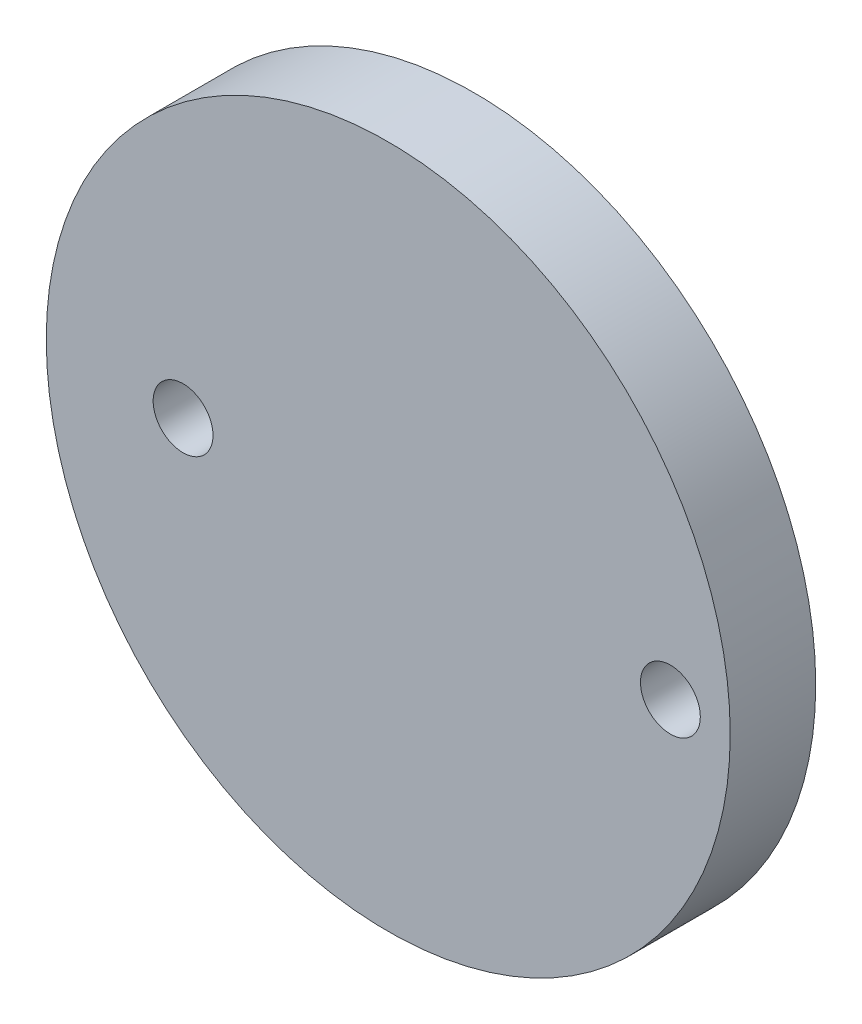
ISO-10303-21;
HEADER;
FILE_DESCRIPTION(('STEP AP214'),'2;1');
FILE_NAME('part.step','',(''),(''),'','','');
FILE_SCHEMA(('AUTOMOTIVE_DESIGN { 1 0 10303 214 1 1 1 1 }'));
ENDSEC;
DATA;
#1=APPLICATION_CONTEXT('core data for automotive mechanical design processes');
#2=APPLICATION_PROTOCOL_DEFINITION('international standard','automotive_design',2000,#1);
#3=PRODUCT_CONTEXT('',#1,'mechanical');
#4=PRODUCT('Part','Part','',(#3));
#5=PRODUCT_RELATED_PRODUCT_CATEGORY('part','',(#4));
#6=PRODUCT_DEFINITION_FORMATION('','',#4);
#7=PRODUCT_DEFINITION_CONTEXT('part definition',#1,'design');
#8=PRODUCT_DEFINITION('design','',#6,#7);
#9=PRODUCT_DEFINITION_SHAPE('','',#8);
#10=(LENGTH_UNIT() NAMED_UNIT(*) SI_UNIT(.MILLI.,.METRE.));
#11=(NAMED_UNIT(*) PLANE_ANGLE_UNIT() SI_UNIT($,.RADIAN.));
#12=(NAMED_UNIT(*) SI_UNIT($,.STERADIAN.) SOLID_ANGLE_UNIT());
#13=UNCERTAINTY_MEASURE_WITH_UNIT(LENGTH_MEASURE(1.E-05),#10,'distance_accuracy_value','');
#14=(GEOMETRIC_REPRESENTATION_CONTEXT(3) GLOBAL_UNCERTAINTY_ASSIGNED_CONTEXT((#13)) GLOBAL_UNIT_ASSIGNED_CONTEXT((#10,
#11,#12)) REPRESENTATION_CONTEXT('',''));
#15=CARTESIAN_POINT('',(0.,0.,0.));
#16=DIRECTION('',(0.,0.,1.));
#17=DIRECTION('',(1.,0.,0.));
#18=AXIS2_PLACEMENT_3D('',#15,#16,#17);
#19=CARTESIAN_POINT('',(0.,0.,5.));
#20=DIRECTION('',(0.,0.,-1.));
#21=DIRECTION('',(-1.,0.,0.));
#22=AXIS2_PLACEMENT_3D('',#19,#20,#21);
#23=CYLINDRICAL_SURFACE('',#22,20.);
#24=CARTESIAN_POINT('',(0.,0.,5.));
#25=DIRECTION('',(0.,0.,1.));
#26=DIRECTION('',(1.,0.,0.));
#27=AXIS2_PLACEMENT_3D('',#24,#25,#26);
#28=CIRCLE('',#27,20.);
#29=CARTESIAN_POINT('',(20.,0.,5.));
#30=VERTEX_POINT('',#29);
#31=EDGE_CURVE('E10',#30,#30,#28,.T.);
#32=ORIENTED_EDGE('',*,*,#31,.F.);
#33=EDGE_LOOP('',(#32));
#34=FACE_BOUND('',#33,.T.);
#35=CARTESIAN_POINT('',(0.,0.,0.));
#36=DIRECTION('',(0.,0.,1.));
#37=DIRECTION('',(1.,0.,0.));
#38=AXIS2_PLACEMENT_3D('',#35,#36,#37);
#39=CIRCLE('',#38,20.);
#40=CARTESIAN_POINT('',(20.,0.,0.));
#41=VERTEX_POINT('',#40);
#42=EDGE_CURVE('E34',#41,#41,#39,.T.);
#43=ORIENTED_EDGE('',*,*,#42,.T.);
#44=EDGE_LOOP('',(#43));
#45=FACE_BOUND('',#44,.T.);
#46=ADVANCED_FACE('F31',(#34,#45),#23,.T.);
#47=CARTESIAN_POINT('',(0.,0.,5.));
#48=DIRECTION('',(0.,0.,1.));
#49=DIRECTION('',(1.,0.,0.));
#50=AXIS2_PLACEMENT_3D('',#47,#48,#49);
#51=PLANE('',#50);
#52=CARTESIAN_POINT('',(-12.,0.,5.));
#53=DIRECTION('',(0.,0.,1.));
#54=DIRECTION('',(1.,0.,0.));
#55=AXIS2_PLACEMENT_3D('',#52,#53,#54);
#56=CIRCLE('',#55,1.75);
#57=CARTESIAN_POINT('',(-10.25,0.,5.));
#58=VERTEX_POINT('',#57);
#59=EDGE_CURVE('E49',#58,#58,#56,.T.);
#60=ORIENTED_EDGE('',*,*,#59,.F.);
#61=EDGE_LOOP('',(#60));
#62=FACE_BOUND('',#61,.T.);
#63=CARTESIAN_POINT('',(16.5,0.,5.));
#64=DIRECTION('',(0.,0.,1.));
#65=DIRECTION('',(1.,0.,0.));
#66=AXIS2_PLACEMENT_3D('',#63,#64,#65);
#67=CIRCLE('',#66,1.75);
#68=CARTESIAN_POINT('',(18.25,0.,5.));
#69=VERTEX_POINT('',#68);
#70=EDGE_CURVE('E43',#69,#69,#67,.T.);
#71=ORIENTED_EDGE('',*,*,#70,.F.);
#72=EDGE_LOOP('',(#71));
#73=FACE_BOUND('',#72,.T.);
#74=ORIENTED_EDGE('',*,*,#31,.T.);
#75=EDGE_LOOP('',(#74));
#76=FACE_BOUND('',#75,.T.);
#77=ADVANCED_FACE('F65',(#62,#73,#76),#51,.T.);
#78=CARTESIAN_POINT('',(0.,0.,0.));
#79=DIRECTION('',(0.,0.,1.));
#80=DIRECTION('',(1.,0.,0.));
#81=AXIS2_PLACEMENT_3D('',#78,#79,#80);
#82=PLANE('',#81);
#83=CARTESIAN_POINT('',(-12.,0.,0.));
#84=DIRECTION('',(0.,0.,1.));
#85=DIRECTION('',(1.,0.,0.));
#86=AXIS2_PLACEMENT_3D('',#83,#84,#85);
#87=CIRCLE('',#86,1.75);
#88=CARTESIAN_POINT('',(-10.25,0.,0.));
#89=VERTEX_POINT('',#88);
#90=EDGE_CURVE('E46',#89,#89,#87,.T.);
#91=ORIENTED_EDGE('',*,*,#90,.T.);
#92=EDGE_LOOP('',(#91));
#93=FACE_BOUND('',#92,.T.);
#94=CARTESIAN_POINT('',(16.5,0.,0.));
#95=DIRECTION('',(0.,0.,1.));
#96=DIRECTION('',(1.,0.,0.));
#97=AXIS2_PLACEMENT_3D('',#94,#95,#96);
#98=CIRCLE('',#97,1.75);
#99=CARTESIAN_POINT('',(18.25,0.,0.));
#100=VERTEX_POINT('',#99);
#101=EDGE_CURVE('E41',#100,#100,#98,.T.);
#102=ORIENTED_EDGE('',*,*,#101,.T.);
#103=EDGE_LOOP('',(#102));
#104=FACE_BOUND('',#103,.T.);
#105=ORIENTED_EDGE('',*,*,#42,.F.);
#106=EDGE_LOOP('',(#105));
#107=FACE_BOUND('',#106,.T.);
#108=ADVANCED_FACE('F55',(#93,#104,#107),#82,.F.);
#109=CARTESIAN_POINT('',(16.5,0.,0.));
#110=DIRECTION('',(0.,0.,1.));
#111=DIRECTION('',(1.,0.,0.));
#112=AXIS2_PLACEMENT_3D('',#109,#110,#111);
#113=CYLINDRICAL_SURFACE('',#112,1.75);
#114=ORIENTED_EDGE('',*,*,#101,.F.);
#115=EDGE_LOOP('',(#114));
#116=FACE_BOUND('',#115,.T.);
#117=ORIENTED_EDGE('',*,*,#70,.T.);
#118=EDGE_LOOP('',(#117));
#119=FACE_BOUND('',#118,.T.);
#120=ADVANCED_FACE('F61',(#116,#119),#113,.F.);
#121=CARTESIAN_POINT('',(-12.,0.,0.));
#122=DIRECTION('',(0.,0.,1.));
#123=DIRECTION('',(1.,0.,0.));
#124=AXIS2_PLACEMENT_3D('',#121,#122,#123);
#125=CYLINDRICAL_SURFACE('',#124,1.75);
#126=ORIENTED_EDGE('',*,*,#90,.F.);
#127=EDGE_LOOP('',(#126));
#128=FACE_BOUND('',#127,.T.);
#129=ORIENTED_EDGE('',*,*,#59,.T.);
#130=EDGE_LOOP('',(#129));
#131=FACE_BOUND('',#130,.T.);
#132=ADVANCED_FACE('F58',(#128,#131),#125,.F.);
#133=CLOSED_SHELL('',(#46,#77,#108,#120,#132));
#134=MANIFOLD_SOLID_BREP('B2',#133);
#135=ADVANCED_BREP_SHAPE_REPRESENTATION('',(#18,#134),#14);
#136=SHAPE_DEFINITION_REPRESENTATION(#9,#135);
ENDSEC;
END-ISO-10303-21;
